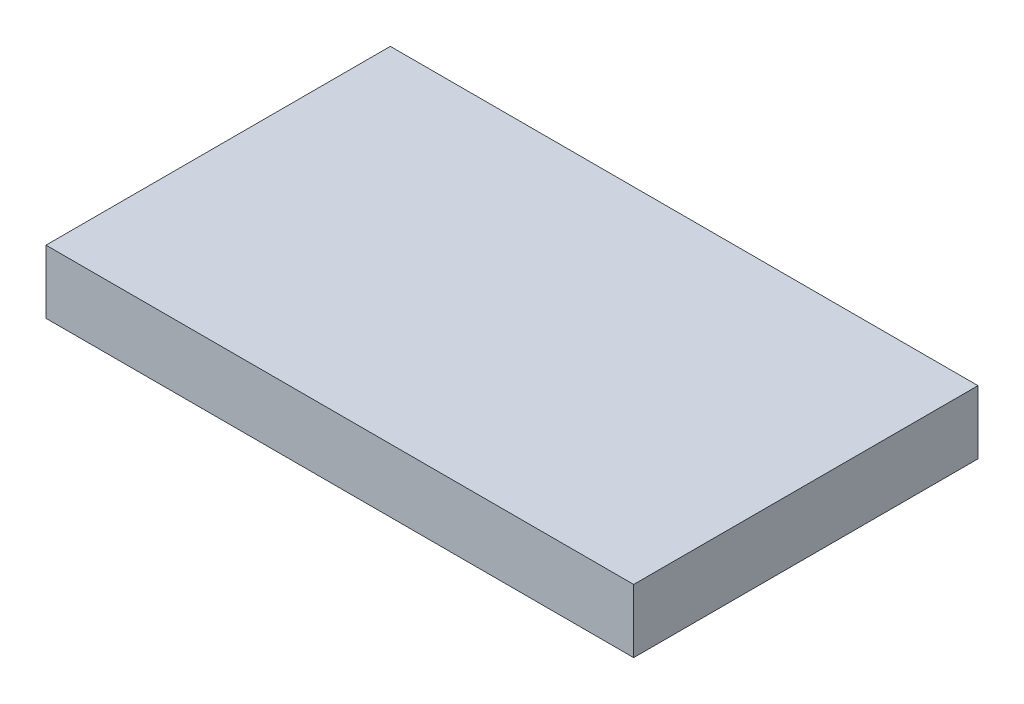
ISO-10303-21;
HEADER;
FILE_DESCRIPTION(('STEP AP214'),'2;1');
FILE_NAME('part.step','',(''),(''),'','','');
FILE_SCHEMA(('AUTOMOTIVE_DESIGN { 1 0 10303 214 1 1 1 1 }'));
ENDSEC;
DATA;
#1=APPLICATION_CONTEXT('core data for automotive mechanical design processes');
#2=APPLICATION_PROTOCOL_DEFINITION('international standard','automotive_design',2000,#1);
#3=PRODUCT_CONTEXT('',#1,'mechanical');
#4=PRODUCT('Part','Part','',(#3));
#5=PRODUCT_RELATED_PRODUCT_CATEGORY('part','',(#4));
#6=PRODUCT_DEFINITION_FORMATION('','',#4);
#7=PRODUCT_DEFINITION_CONTEXT('part definition',#1,'design');
#8=PRODUCT_DEFINITION('design','',#6,#7);
#9=PRODUCT_DEFINITION_SHAPE('','',#8);
#10=(LENGTH_UNIT() NAMED_UNIT(*) SI_UNIT(.MILLI.,.METRE.));
#11=(NAMED_UNIT(*) PLANE_ANGLE_UNIT() SI_UNIT($,.RADIAN.));
#12=(NAMED_UNIT(*) SI_UNIT($,.STERADIAN.) SOLID_ANGLE_UNIT());
#13=UNCERTAINTY_MEASURE_WITH_UNIT(LENGTH_MEASURE(1.E-05),#10,'distance_accuracy_value','');
#14=(GEOMETRIC_REPRESENTATION_CONTEXT(3) GLOBAL_UNCERTAINTY_ASSIGNED_CONTEXT((#13)) GLOBAL_UNIT_ASSIGNED_CONTEXT((#10,
#11,#12)) REPRESENTATION_CONTEXT('',''));
#15=CARTESIAN_POINT('',(0.,0.,0.));
#16=DIRECTION('',(0.,0.,1.));
#17=DIRECTION('',(1.,0.,0.));
#18=AXIS2_PLACEMENT_3D('',#15,#16,#17);
#19=CARTESIAN_POINT('',(29.425,6.35,-17.24));
#20=DIRECTION('',(-1.,0.,0.));
#21=DIRECTION('',(0.,0.,1.));
#22=AXIS2_PLACEMENT_3D('',#19,#20,#21);
#23=PLANE('',#22);
#24=DIRECTION('',(0.,0.,-1.));
#25=VECTOR('',#24,1.);
#26=CARTESIAN_POINT('',(29.425,0.,-17.24));
#27=LINE('',#26,#25);
#28=CARTESIAN_POINT('',(29.425,0.,17.24));
#29=VERTEX_POINT('',#28);
#30=CARTESIAN_POINT('',(29.425,0.,-17.24));
#31=VERTEX_POINT('',#30);
#32=EDGE_CURVE('E99',#29,#31,#27,.T.);
#33=ORIENTED_EDGE('',*,*,#32,.T.);
#34=DIRECTION('',(0.,-1.,0.));
#35=VECTOR('',#34,1.);
#36=CARTESIAN_POINT('',(29.425,6.35,-17.24));
#37=LINE('',#36,#35);
#38=CARTESIAN_POINT('',(29.425,6.35,-17.24));
#39=VERTEX_POINT('',#38);
#40=EDGE_CURVE('E11',#39,#31,#37,.T.);
#41=ORIENTED_EDGE('',*,*,#40,.F.);
#42=DIRECTION('',(0.,0.,-1.));
#43=VECTOR('',#42,1.);
#44=CARTESIAN_POINT('',(29.425,6.35,-17.24));
#45=LINE('',#44,#43);
#46=CARTESIAN_POINT('',(29.425,6.35,17.24));
#47=VERTEX_POINT('',#46);
#48=EDGE_CURVE('E87',#47,#39,#45,.T.);
#49=ORIENTED_EDGE('',*,*,#48,.F.);
#50=DIRECTION('',(0.,-1.,0.));
#51=VECTOR('',#50,1.);
#52=CARTESIAN_POINT('',(29.425,6.35,17.24));
#53=LINE('',#52,#51);
#54=EDGE_CURVE('E95',#47,#29,#53,.T.);
#55=ORIENTED_EDGE('',*,*,#54,.T.);
#56=EDGE_LOOP('',(#33,#41,#49,#55));
#57=FACE_BOUND('',#56,.T.);
#58=ADVANCED_FACE('F36',(#57),#23,.F.);
#59=CARTESIAN_POINT('',(-29.425,6.35,-17.24));
#60=DIRECTION('',(0.,0.,1.));
#61=DIRECTION('',(1.,0.,0.));
#62=AXIS2_PLACEMENT_3D('',#59,#60,#61);
#63=PLANE('',#62);
#64=DIRECTION('',(-1.,0.,0.));
#65=VECTOR('',#64,1.);
#66=CARTESIAN_POINT('',(-29.425,0.,-17.24));
#67=LINE('',#66,#65);
#68=CARTESIAN_POINT('',(-29.425,0.,-17.24));
#69=VERTEX_POINT('',#68);
#70=EDGE_CURVE('E91',#31,#69,#67,.T.);
#71=ORIENTED_EDGE('',*,*,#70,.T.);
#72=DIRECTION('',(0.,-1.,0.));
#73=VECTOR('',#72,1.);
#74=CARTESIAN_POINT('',(-29.425,6.35,-17.24));
#75=LINE('',#74,#73);
#76=CARTESIAN_POINT('',(-29.425,6.35,-17.24));
#77=VERTEX_POINT('',#76);
#78=EDGE_CURVE('E44',#77,#69,#75,.T.);
#79=ORIENTED_EDGE('',*,*,#78,.F.);
#80=DIRECTION('',(-1.,0.,0.));
#81=VECTOR('',#80,1.);
#82=CARTESIAN_POINT('',(-29.425,6.35,-17.24));
#83=LINE('',#82,#81);
#84=EDGE_CURVE('E82',#39,#77,#83,.T.);
#85=ORIENTED_EDGE('',*,*,#84,.F.);
#86=ORIENTED_EDGE('',*,*,#40,.T.);
#87=EDGE_LOOP('',(#71,#79,#85,#86));
#88=FACE_BOUND('',#87,.T.);
#89=ADVANCED_FACE('F90',(#88),#63,.F.);
#90=CARTESIAN_POINT('',(-29.425,6.35,-17.24));
#91=DIRECTION('',(1.,0.,0.));
#92=DIRECTION('',(0.,0.,-1.));
#93=AXIS2_PLACEMENT_3D('',#90,#91,#92);
#94=PLANE('',#93);
#95=DIRECTION('',(0.,0.,1.));
#96=VECTOR('',#95,1.);
#97=CARTESIAN_POINT('',(-29.425,0.,-17.24));
#98=LINE('',#97,#96);
#99=CARTESIAN_POINT('',(-29.425,0.,17.24));
#100=VERTEX_POINT('',#99);
#101=EDGE_CURVE('E69',#69,#100,#98,.T.);
#102=ORIENTED_EDGE('',*,*,#101,.T.);
#103=DIRECTION('',(0.,-1.,0.));
#104=VECTOR('',#103,1.);
#105=CARTESIAN_POINT('',(-29.425,6.35,17.24));
#106=LINE('',#105,#104);
#107=CARTESIAN_POINT('',(-29.425,6.35,17.24));
#108=VERTEX_POINT('',#107);
#109=EDGE_CURVE('E92',#108,#100,#106,.T.);
#110=ORIENTED_EDGE('',*,*,#109,.F.);
#111=DIRECTION('',(0.,0.,1.));
#112=VECTOR('',#111,1.);
#113=CARTESIAN_POINT('',(-29.425,6.35,-17.24));
#114=LINE('',#113,#112);
#115=EDGE_CURVE('E85',#77,#108,#114,.T.);
#116=ORIENTED_EDGE('',*,*,#115,.F.);
#117=ORIENTED_EDGE('',*,*,#78,.T.);
#118=EDGE_LOOP('',(#102,#110,#116,#117));
#119=FACE_BOUND('',#118,.T.);
#120=ADVANCED_FACE('F93',(#119),#94,.F.);
#121=CARTESIAN_POINT('',(-29.425,6.35,17.24));
#122=DIRECTION('',(0.,0.,-1.));
#123=DIRECTION('',(-1.,0.,0.));
#124=AXIS2_PLACEMENT_3D('',#121,#122,#123);
#125=PLANE('',#124);
#126=DIRECTION('',(1.,0.,0.));
#127=VECTOR('',#126,1.);
#128=CARTESIAN_POINT('',(-29.425,0.,17.24));
#129=LINE('',#128,#127);
#130=EDGE_CURVE('E75',#100,#29,#129,.T.);
#131=ORIENTED_EDGE('',*,*,#130,.T.);
#132=ORIENTED_EDGE('',*,*,#54,.F.);
#133=DIRECTION('',(1.,0.,0.));
#134=VECTOR('',#133,1.);
#135=CARTESIAN_POINT('',(-29.425,6.35,17.24));
#136=LINE('',#135,#134);
#137=EDGE_CURVE('E52',#108,#47,#136,.T.);
#138=ORIENTED_EDGE('',*,*,#137,.F.);
#139=ORIENTED_EDGE('',*,*,#109,.T.);
#140=EDGE_LOOP('',(#131,#132,#138,#139));
#141=FACE_BOUND('',#140,.T.);
#142=ADVANCED_FACE('F106',(#141),#125,.F.);
#143=CARTESIAN_POINT('',(0.,6.35,0.));
#144=DIRECTION('',(0.,1.,0.));
#145=DIRECTION('',(0.,0.,1.));
#146=AXIS2_PLACEMENT_3D('',#143,#144,#145);
#147=PLANE('',#146);
#148=ORIENTED_EDGE('',*,*,#48,.T.);
#149=ORIENTED_EDGE('',*,*,#84,.T.);
#150=ORIENTED_EDGE('',*,*,#115,.T.);
#151=ORIENTED_EDGE('',*,*,#137,.T.);
#152=EDGE_LOOP('',(#148,#149,#150,#151));
#153=FACE_BOUND('',#152,.T.);
#154=ADVANCED_FACE('F83',(#153),#147,.T.);
#155=CARTESIAN_POINT('',(0.,0.,0.));
#156=DIRECTION('',(0.,1.,0.));
#157=DIRECTION('',(0.,0.,1.));
#158=AXIS2_PLACEMENT_3D('',#155,#156,#157);
#159=PLANE('',#158);
#160=ORIENTED_EDGE('',*,*,#32,.F.);
#161=ORIENTED_EDGE('',*,*,#130,.F.);
#162=ORIENTED_EDGE('',*,*,#101,.F.);
#163=ORIENTED_EDGE('',*,*,#70,.F.);
#164=EDGE_LOOP('',(#160,#161,#162,#163));
#165=FACE_BOUND('',#164,.T.);
#166=ADVANCED_FACE('F109',(#165),#159,.F.);
#167=CLOSED_SHELL('',(#58,#89,#120,#142,#154,#166));
#168=MANIFOLD_SOLID_BREP('B2',#167);
#169=ADVANCED_BREP_SHAPE_REPRESENTATION('',(#18,#168),#14);
#170=SHAPE_DEFINITION_REPRESENTATION(#9,#169);
ENDSEC;
END-ISO-10303-21;
